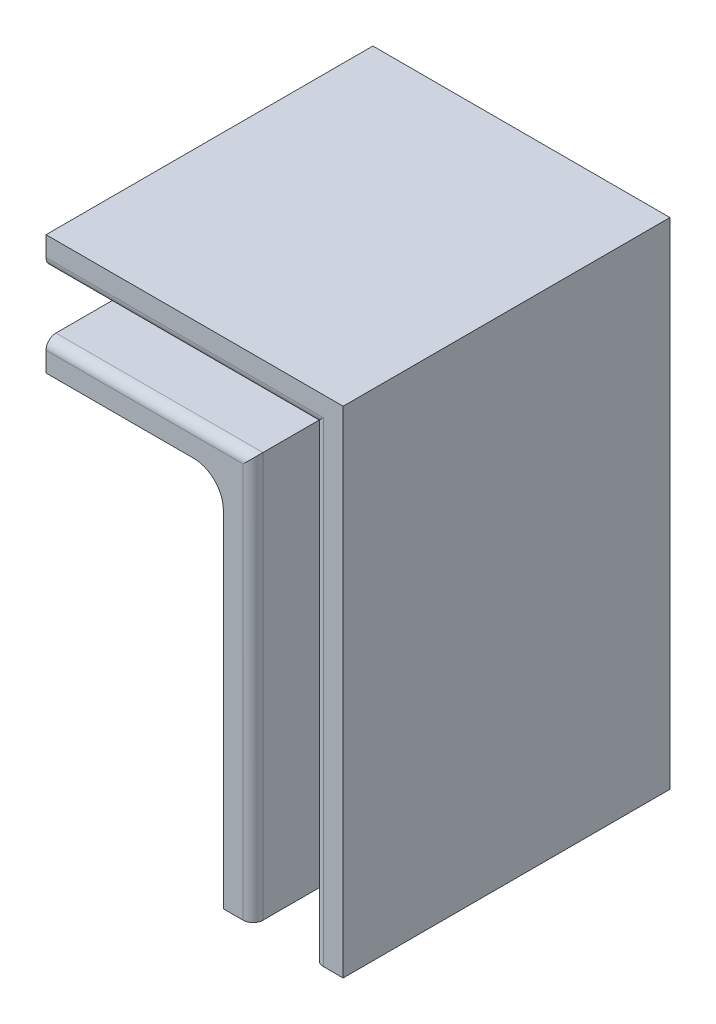
ISO-10303-21;
HEADER;
FILE_DESCRIPTION(('STEP AP214'),'2;1');
FILE_NAME('part.step','',(''),(''),'','','');
FILE_SCHEMA(('AUTOMOTIVE_DESIGN { 1 0 10303 214 1 1 1 1 }'));
ENDSEC;
DATA;
#1=APPLICATION_CONTEXT('core data for automotive mechanical design processes');
#2=APPLICATION_PROTOCOL_DEFINITION('international standard','automotive_design',2000,#1);
#3=PRODUCT_CONTEXT('',#1,'mechanical');
#4=PRODUCT('Part','Part','',(#3));
#5=PRODUCT_RELATED_PRODUCT_CATEGORY('part','',(#4));
#6=PRODUCT_DEFINITION_FORMATION('','',#4);
#7=PRODUCT_DEFINITION_CONTEXT('part definition',#1,'design');
#8=PRODUCT_DEFINITION('design','',#6,#7);
#9=PRODUCT_DEFINITION_SHAPE('','',#8);
#10=(LENGTH_UNIT() NAMED_UNIT(*) SI_UNIT(.MILLI.,.METRE.));
#11=(NAMED_UNIT(*) PLANE_ANGLE_UNIT() SI_UNIT($,.RADIAN.));
#12=(NAMED_UNIT(*) SI_UNIT($,.STERADIAN.) SOLID_ANGLE_UNIT());
#13=UNCERTAINTY_MEASURE_WITH_UNIT(LENGTH_MEASURE(1.E-05),#10,'distance_accuracy_value','');
#14=(GEOMETRIC_REPRESENTATION_CONTEXT(3) GLOBAL_UNCERTAINTY_ASSIGNED_CONTEXT((#13)) GLOBAL_UNIT_ASSIGNED_CONTEXT((#10,
#11,#12)) REPRESENTATION_CONTEXT('',''));
#15=CARTESIAN_POINT('',(0.,0.,0.));
#16=DIRECTION('',(0.,0.,1.));
#17=DIRECTION('',(1.,0.,0.));
#18=AXIS2_PLACEMENT_3D('',#15,#16,#17);
#19=CARTESIAN_POINT('',(0.,0.,3.));
#20=DIRECTION('',(0.,0.,-1.));
#21=DIRECTION('',(-1.,0.,0.));
#22=AXIS2_PLACEMENT_3D('',#19,#20,#21);
#23=PLANE('',#22);
#24=DIRECTION('',(0.,-1.,0.));
#25=VECTOR('',#24,1.);
#26=CARTESIAN_POINT('',(14.9,37.9,3.));
#27=LINE('',#26,#25);
#28=CARTESIAN_POINT('',(14.9,0.,3.));
#29=VERTEX_POINT('',#28);
#30=CARTESIAN_POINT('',(14.9,34.9,3.));
#31=VERTEX_POINT('',#30);
#32=EDGE_CURVE('E280',#29,#31,#27,.F.);
#33=ORIENTED_EDGE('',*,*,#32,.T.);
#34=DIRECTION('',(1.,0.,0.));
#35=VECTOR('',#34,1.);
#36=CARTESIAN_POINT('',(0.,34.9,3.));
#37=LINE('',#36,#35);
#38=CARTESIAN_POINT('',(0.,34.9,3.));
#39=VERTEX_POINT('',#38);
#40=EDGE_CURVE('E282',#31,#39,#37,.F.);
#41=ORIENTED_EDGE('',*,*,#40,.T.);
#42=DIRECTION('',(0.,-1.,0.));
#43=VECTOR('',#42,1.);
#44=CARTESIAN_POINT('',(0.,0.,3.));
#45=LINE('',#44,#43);
#46=CARTESIAN_POINT('',(0.,0.,3.));
#47=VERTEX_POINT('',#46);
#48=EDGE_CURVE('E231',#39,#47,#45,.T.);
#49=ORIENTED_EDGE('',*,*,#48,.T.);
#50=DIRECTION('',(1.,0.,0.));
#51=VECTOR('',#50,1.);
#52=CARTESIAN_POINT('',(0.,0.,3.));
#53=LINE('',#52,#51);
#54=EDGE_CURVE('E235',#47,#29,#53,.T.);
#55=ORIENTED_EDGE('',*,*,#54,.T.);
#56=EDGE_LOOP('',(#33,#41,#49,#55));
#57=FACE_BOUND('',#56,.T.);
#58=ADVANCED_FACE('F33',(#57),#23,.F.);
#59=DIRECTION('',(0.,-1.,0.));
#60=VECTOR('',#59,1.);
#61=CARTESIAN_POINT('',(24.,47.,3.));
#62=LINE('',#61,#60);
#63=CARTESIAN_POINT('',(24.,0.,3.));
#64=VERTEX_POINT('',#63);
#65=CARTESIAN_POINT('',(24.,44.,3.));
#66=VERTEX_POINT('',#65);
#67=EDGE_CURVE('E265',#64,#66,#62,.F.);
#68=ORIENTED_EDGE('',*,*,#67,.T.);
#69=DIRECTION('',(1.,0.,0.));
#70=VECTOR('',#69,1.);
#71=CARTESIAN_POINT('',(0.,44.,3.));
#72=LINE('',#71,#70);
#73=CARTESIAN_POINT('',(0.,44.,3.));
#74=VERTEX_POINT('',#73);
#75=EDGE_CURVE('E267',#66,#74,#72,.F.);
#76=ORIENTED_EDGE('',*,*,#75,.T.);
#77=CARTESIAN_POINT('',(0.,43.9,3.));
#78=VERTEX_POINT('',#77);
#79=EDGE_CURVE('E233',#74,#78,#45,.T.);
#80=ORIENTED_EDGE('',*,*,#79,.T.);
#81=DIRECTION('',(-1.,0.,0.));
#82=VECTOR('',#81,1.);
#83=CARTESIAN_POINT('',(20.9,43.9,3.));
#84=LINE('',#83,#82);
#85=CARTESIAN_POINT('',(23.9,43.9,3.));
#86=VERTEX_POINT('',#85);
#87=EDGE_CURVE('E263',#78,#86,#84,.F.);
#88=ORIENTED_EDGE('',*,*,#87,.T.);
#89=DIRECTION('',(0.,1.,0.));
#90=VECTOR('',#89,1.);
#91=CARTESIAN_POINT('',(23.9,0.,3.));
#92=LINE('',#91,#90);
#93=CARTESIAN_POINT('',(23.9,0.,3.));
#94=VERTEX_POINT('',#93);
#95=EDGE_CURVE('E261',#86,#94,#92,.F.);
#96=ORIENTED_EDGE('',*,*,#95,.T.);
#97=EDGE_CURVE('E239',#94,#64,#53,.T.);
#98=ORIENTED_EDGE('',*,*,#97,.T.);
#99=EDGE_LOOP('',(#68,#76,#80,#88,#96,#98));
#100=FACE_BOUND('',#99,.T.);
#101=ADVANCED_FACE('F379',(#100),#23,.F.);
#102=CARTESIAN_POINT('',(0.,0.,3.));
#103=DIRECTION('',(1.,0.,0.));
#104=DIRECTION('',(0.,0.,-1.));
#105=AXIS2_PLACEMENT_3D('',#102,#103,#104);
#106=PLANE('',#105);
#107=DIRECTION('',(0.,-1.,0.));
#108=VECTOR('',#107,1.);
#109=CARTESIAN_POINT('',(0.,37.9,33.));
#110=LINE('',#109,#108);
#111=CARTESIAN_POINT('',(0.,39.9,33.));
#112=VERTEX_POINT('',#111);
#113=CARTESIAN_POINT('',(0.,37.9,33.));
#114=VERTEX_POINT('',#113);
#115=EDGE_CURVE('E182',#112,#114,#110,.T.);
#116=ORIENTED_EDGE('',*,*,#115,.F.);
#117=CARTESIAN_POINT('',(0.,39.9,32.));
#118=DIRECTION('',(1.,0.,0.));
#119=DIRECTION('',(0.,0.,-1.));
#120=AXIS2_PLACEMENT_3D('',#117,#118,#119);
#121=CIRCLE('',#120,1.);
#122=CARTESIAN_POINT('',(0.,40.9,32.));
#123=VERTEX_POINT('',#122);
#124=EDGE_CURVE('E324',#112,#123,#121,.F.);
#125=ORIENTED_EDGE('',*,*,#124,.T.);
#126=DIRECTION('',(0.,0.,-1.));
#127=VECTOR('',#126,1.);
#128=CARTESIAN_POINT('',(0.,40.9,33.));
#129=LINE('',#128,#127);
#130=CARTESIAN_POINT('',(0.,40.9,6.));
#131=VERTEX_POINT('',#130);
#132=EDGE_CURVE('E401',#123,#131,#129,.T.);
#133=ORIENTED_EDGE('',*,*,#132,.T.);
#134=CARTESIAN_POINT('',(0.,43.9,6.));
#135=DIRECTION('',(1.,0.,0.));
#136=DIRECTION('',(0.,0.,-1.));
#137=AXIS2_PLACEMENT_3D('',#134,#135,#136);
#138=CIRCLE('',#137,3.);
#139=EDGE_CURVE('E290',#131,#78,#138,.T.);
#140=ORIENTED_EDGE('',*,*,#139,.T.);
#141=ORIENTED_EDGE('',*,*,#79,.F.);
#142=CARTESIAN_POINT('',(0.,44.,6.));
#143=DIRECTION('',(1.,0.,0.));
#144=DIRECTION('',(0.,0.,-1.));
#145=AXIS2_PLACEMENT_3D('',#142,#143,#144);
#146=CIRCLE('',#145,3.);
#147=CARTESIAN_POINT('',(0.,47.,6.));
#148=VERTEX_POINT('',#147);
#149=EDGE_CURVE('E292',#74,#148,#146,.T.);
#150=ORIENTED_EDGE('',*,*,#149,.T.);
#151=DIRECTION('',(0.,0.,-1.));
#152=VECTOR('',#151,1.);
#153=CARTESIAN_POINT('',(0.,47.,33.));
#154=LINE('',#153,#152);
#155=CARTESIAN_POINT('',(0.,47.,32.));
#156=VERTEX_POINT('',#155);
#157=EDGE_CURVE('E228',#156,#148,#154,.T.);
#158=ORIENTED_EDGE('',*,*,#157,.F.);
#159=CARTESIAN_POINT('',(0.,48.,32.));
#160=DIRECTION('',(1.,0.,0.));
#161=DIRECTION('',(0.,0.,-1.));
#162=AXIS2_PLACEMENT_3D('',#159,#160,#161);
#163=CIRCLE('',#162,1.);
#164=CARTESIAN_POINT('',(0.,48.,33.));
#165=VERTEX_POINT('',#164);
#166=EDGE_CURVE('E322',#156,#165,#163,.F.);
#167=ORIENTED_EDGE('',*,*,#166,.T.);
#168=DIRECTION('',(0.,-1.,0.));
#169=VECTOR('',#168,1.);
#170=CARTESIAN_POINT('',(0.,47.,33.));
#171=LINE('',#170,#169);
#172=CARTESIAN_POINT('',(0.,50.,33.));
#173=VERTEX_POINT('',#172);
#174=EDGE_CURVE('E206',#173,#165,#171,.T.);
#175=ORIENTED_EDGE('',*,*,#174,.F.);
#176=DIRECTION('',(0.,0.,-1.));
#177=VECTOR('',#176,1.);
#178=CARTESIAN_POINT('',(0.,50.,3.));
#179=LINE('',#178,#177);
#180=CARTESIAN_POINT('',(0.,50.,0.));
#181=VERTEX_POINT('',#180);
#182=EDGE_CURVE('E238',#173,#181,#179,.T.);
#183=ORIENTED_EDGE('',*,*,#182,.T.);
#184=DIRECTION('',(0.,-1.,0.));
#185=VECTOR('',#184,1.);
#186=CARTESIAN_POINT('',(0.,0.,0.));
#187=LINE('',#186,#185);
#188=CARTESIAN_POINT('',(0.,0.,0.));
#189=VERTEX_POINT('',#188);
#190=EDGE_CURVE('E230',#181,#189,#187,.T.);
#191=ORIENTED_EDGE('',*,*,#190,.T.);
#192=DIRECTION('',(0.,0.,-1.));
#193=VECTOR('',#192,1.);
#194=CARTESIAN_POINT('',(0.,0.,3.));
#195=LINE('',#194,#193);
#196=EDGE_CURVE('E255',#47,#189,#195,.T.);
#197=ORIENTED_EDGE('',*,*,#196,.F.);
#198=ORIENTED_EDGE('',*,*,#48,.F.);
#199=CARTESIAN_POINT('',(0.,34.9,6.));
#200=DIRECTION('',(1.,0.,0.));
#201=DIRECTION('',(0.,0.,-1.));
#202=AXIS2_PLACEMENT_3D('',#199,#200,#201);
#203=CIRCLE('',#202,3.);
#204=CARTESIAN_POINT('',(0.,37.9,6.));
#205=VERTEX_POINT('',#204);
#206=EDGE_CURVE('E205',#39,#205,#203,.T.);
#207=ORIENTED_EDGE('',*,*,#206,.T.);
#208=DIRECTION('',(0.,0.,-1.));
#209=VECTOR('',#208,1.);
#210=CARTESIAN_POINT('',(0.,37.9,33.));
#211=LINE('',#210,#209);
#212=EDGE_CURVE('E196',#114,#205,#211,.T.);
#213=ORIENTED_EDGE('',*,*,#212,.F.);
#214=EDGE_LOOP('',(#116,#125,#133,#140,#141,#150,#158,#167,#175,#183,#191,#197,#198,#207,#213));
#215=FACE_BOUND('',#214,.T.);
#216=ADVANCED_FACE('F202',(#215),#106,.F.);
#217=CARTESIAN_POINT('',(0.,0.,3.));
#218=DIRECTION('',(0.,1.,0.));
#219=DIRECTION('',(0.,0.,1.));
#220=AXIS2_PLACEMENT_3D('',#217,#218,#219);
#221=PLANE('',#220);
#222=DIRECTION('',(1.,0.,0.));
#223=VECTOR('',#222,1.);
#224=CARTESIAN_POINT('',(30.,0.,33.));
#225=LINE('',#224,#223);
#226=CARTESIAN_POINT('',(28.,0.,33.));
#227=VERTEX_POINT('',#226);
#228=CARTESIAN_POINT('',(30.,0.,33.));
#229=VERTEX_POINT('',#228);
#230=EDGE_CURVE('E210',#227,#229,#225,.T.);
#231=ORIENTED_EDGE('',*,*,#230,.F.);
#232=CARTESIAN_POINT('',(28.,0.,32.));
#233=DIRECTION('',(0.,1.,0.));
#234=DIRECTION('',(0.,0.,1.));
#235=AXIS2_PLACEMENT_3D('',#232,#233,#234);
#236=CIRCLE('',#235,1.);
#237=CARTESIAN_POINT('',(27.,0.,32.));
#238=VERTEX_POINT('',#237);
#239=EDGE_CURVE('E56',#227,#238,#236,.F.);
#240=ORIENTED_EDGE('',*,*,#239,.T.);
#241=DIRECTION('',(0.,0.,-1.));
#242=VECTOR('',#241,1.);
#243=CARTESIAN_POINT('',(27.,0.,33.));
#244=LINE('',#243,#242);
#245=CARTESIAN_POINT('',(27.,0.,6.));
#246=VERTEX_POINT('',#245);
#247=EDGE_CURVE('E224',#238,#246,#244,.T.);
#248=ORIENTED_EDGE('',*,*,#247,.T.);
#249=CARTESIAN_POINT('',(24.,0.,6.));
#250=DIRECTION('',(0.,1.,0.));
#251=DIRECTION('',(0.,0.,1.));
#252=AXIS2_PLACEMENT_3D('',#249,#250,#251);
#253=CIRCLE('',#252,3.);
#254=EDGE_CURVE('E300',#246,#64,#253,.T.);
#255=ORIENTED_EDGE('',*,*,#254,.T.);
#256=ORIENTED_EDGE('',*,*,#97,.F.);
#257=CARTESIAN_POINT('',(23.9,0.,6.));
#258=DIRECTION('',(0.,1.,0.));
#259=DIRECTION('',(0.,0.,1.));
#260=AXIS2_PLACEMENT_3D('',#257,#258,#259);
#261=CIRCLE('',#260,3.);
#262=CARTESIAN_POINT('',(20.9,0.,6.));
#263=VERTEX_POINT('',#262);
#264=EDGE_CURVE('E302',#94,#263,#261,.T.);
#265=ORIENTED_EDGE('',*,*,#264,.T.);
#266=DIRECTION('',(0.,0.,-1.));
#267=VECTOR('',#266,1.);
#268=CARTESIAN_POINT('',(20.9,0.,33.));
#269=LINE('',#268,#267);
#270=CARTESIAN_POINT('',(20.9,0.,32.));
#271=VERTEX_POINT('',#270);
#272=EDGE_CURVE('E213',#271,#263,#269,.T.);
#273=ORIENTED_EDGE('',*,*,#272,.F.);
#274=CARTESIAN_POINT('',(19.9,0.,32.));
#275=DIRECTION('',(0.,1.,0.));
#276=DIRECTION('',(0.,0.,1.));
#277=AXIS2_PLACEMENT_3D('',#274,#275,#276);
#278=CIRCLE('',#277,1.);
#279=CARTESIAN_POINT('',(19.9,0.,33.));
#280=VERTEX_POINT('',#279);
#281=EDGE_CURVE('E335',#271,#280,#278,.F.);
#282=ORIENTED_EDGE('',*,*,#281,.T.);
#283=DIRECTION('',(1.,0.,0.));
#284=VECTOR('',#283,1.);
#285=CARTESIAN_POINT('',(20.9,0.,33.));
#286=LINE('',#285,#284);
#287=CARTESIAN_POINT('',(17.9,0.,33.));
#288=VERTEX_POINT('',#287);
#289=EDGE_CURVE('E398',#288,#280,#286,.T.);
#290=ORIENTED_EDGE('',*,*,#289,.F.);
#291=DIRECTION('',(0.,0.,-1.));
#292=VECTOR('',#291,1.);
#293=CARTESIAN_POINT('',(17.9,0.,33.));
#294=LINE('',#293,#292);
#295=CARTESIAN_POINT('',(17.9,0.,6.));
#296=VERTEX_POINT('',#295);
#297=EDGE_CURVE('E207',#288,#296,#294,.T.);
#298=ORIENTED_EDGE('',*,*,#297,.T.);
#299=CARTESIAN_POINT('',(14.9,0.,6.));
#300=DIRECTION('',(0.,1.,0.));
#301=DIRECTION('',(0.,0.,1.));
#302=AXIS2_PLACEMENT_3D('',#299,#300,#301);
#303=CIRCLE('',#302,3.);
#304=EDGE_CURVE('E298',#296,#29,#303,.T.);
#305=ORIENTED_EDGE('',*,*,#304,.T.);
#306=ORIENTED_EDGE('',*,*,#54,.F.);
#307=ORIENTED_EDGE('',*,*,#196,.T.);
#308=DIRECTION('',(1.,0.,0.));
#309=VECTOR('',#308,1.);
#310=CARTESIAN_POINT('',(0.,0.,0.));
#311=LINE('',#310,#309);
#312=CARTESIAN_POINT('',(30.,0.,0.));
#313=VERTEX_POINT('',#312);
#314=EDGE_CURVE('E242',#189,#313,#311,.T.);
#315=ORIENTED_EDGE('',*,*,#314,.T.);
#316=DIRECTION('',(0.,0.,-1.));
#317=VECTOR('',#316,1.);
#318=CARTESIAN_POINT('',(30.,0.,3.));
#319=LINE('',#318,#317);
#320=EDGE_CURVE('E252',#229,#313,#319,.T.);
#321=ORIENTED_EDGE('',*,*,#320,.F.);
#322=EDGE_LOOP('',(#231,#240,#248,#255,#256,#265,#273,#282,#290,#298,#305,#306,#307,#315,#321));
#323=FACE_BOUND('',#322,.T.);
#324=ADVANCED_FACE('F376',(#323),#221,.F.);
#325=CARTESIAN_POINT('',(30.,0.,3.));
#326=DIRECTION('',(-1.,0.,0.));
#327=DIRECTION('',(0.,0.,1.));
#328=AXIS2_PLACEMENT_3D('',#325,#326,#327);
#329=PLANE('',#328);
#330=DIRECTION('',(0.,1.,0.));
#331=VECTOR('',#330,1.);
#332=CARTESIAN_POINT('',(30.,0.,0.));
#333=LINE('',#332,#331);
#334=CARTESIAN_POINT('',(30.,50.,0.));
#335=VERTEX_POINT('',#334);
#336=EDGE_CURVE('E244',#313,#335,#333,.T.);
#337=ORIENTED_EDGE('',*,*,#336,.T.);
#338=DIRECTION('',(0.,0.,-1.));
#339=VECTOR('',#338,1.);
#340=CARTESIAN_POINT('',(30.,50.,3.));
#341=LINE('',#340,#339);
#342=CARTESIAN_POINT('',(30.,50.,33.));
#343=VERTEX_POINT('',#342);
#344=EDGE_CURVE('E249',#343,#335,#341,.T.);
#345=ORIENTED_EDGE('',*,*,#344,.F.);
#346=DIRECTION('',(0.,1.,0.));
#347=VECTOR('',#346,1.);
#348=CARTESIAN_POINT('',(30.,50.,33.));
#349=LINE('',#348,#347);
#350=EDGE_CURVE('E218',#229,#343,#349,.T.);
#351=ORIENTED_EDGE('',*,*,#350,.F.);
#352=ORIENTED_EDGE('',*,*,#320,.T.);
#353=EDGE_LOOP('',(#337,#345,#351,#352));
#354=FACE_BOUND('',#353,.T.);
#355=ADVANCED_FACE('F436',(#354),#329,.F.);
#356=CARTESIAN_POINT('',(0.,50.,3.));
#357=DIRECTION('',(0.,-1.,0.));
#358=DIRECTION('',(0.,0.,-1.));
#359=AXIS2_PLACEMENT_3D('',#356,#357,#358);
#360=PLANE('',#359);
#361=DIRECTION('',(-1.,0.,0.));
#362=VECTOR('',#361,1.);
#363=CARTESIAN_POINT('',(0.,50.,0.));
#364=LINE('',#363,#362);
#365=EDGE_CURVE('E234',#335,#181,#364,.T.);
#366=ORIENTED_EDGE('',*,*,#365,.T.);
#367=ORIENTED_EDGE('',*,*,#182,.F.);
#368=DIRECTION('',(-1.,0.,0.));
#369=VECTOR('',#368,1.);
#370=CARTESIAN_POINT('',(0.,50.,33.));
#371=LINE('',#370,#369);
#372=EDGE_CURVE('E221',#343,#173,#371,.T.);
#373=ORIENTED_EDGE('',*,*,#372,.F.);
#374=ORIENTED_EDGE('',*,*,#344,.T.);
#375=EDGE_LOOP('',(#366,#367,#373,#374));
#376=FACE_BOUND('',#375,.T.);
#377=ADVANCED_FACE('F432',(#376),#360,.F.);
#378=CARTESIAN_POINT('',(0.,0.,0.));
#379=DIRECTION('',(0.,0.,-1.));
#380=DIRECTION('',(-1.,0.,0.));
#381=AXIS2_PLACEMENT_3D('',#378,#379,#380);
#382=PLANE('',#381);
#383=ORIENTED_EDGE('',*,*,#190,.F.);
#384=ORIENTED_EDGE('',*,*,#365,.F.);
#385=ORIENTED_EDGE('',*,*,#336,.F.);
#386=ORIENTED_EDGE('',*,*,#314,.F.);
#387=EDGE_LOOP('',(#383,#384,#385,#386));
#388=FACE_BOUND('',#387,.T.);
#389=ADVANCED_FACE('F429',(#388),#382,.T.);
#390=CARTESIAN_POINT('',(27.,47.,33.));
#391=DIRECTION('',(0.,1.,0.));
#392=DIRECTION('',(0.,0.,1.));
#393=AXIS2_PLACEMENT_3D('',#390,#391,#392);
#394=PLANE('',#393);
#395=DIRECTION('',(0.,0.,-1.));
#396=VECTOR('',#395,1.);
#397=CARTESIAN_POINT('',(27.,47.,33.));
#398=LINE('',#397,#396);
#399=CARTESIAN_POINT('',(27.,47.,32.));
#400=VERTEX_POINT('',#399);
#401=CARTESIAN_POINT('',(27.,47.,6.));
#402=VERTEX_POINT('',#401);
#403=EDGE_CURVE('E226',#400,#402,#398,.T.);
#404=ORIENTED_EDGE('',*,*,#403,.F.);
#405=DIRECTION('',(1.,0.,0.));
#406=VECTOR('',#405,1.);
#407=CARTESIAN_POINT('',(27.,47.,32.));
#408=LINE('',#407,#406);
#409=EDGE_CURVE('E333',#400,#156,#408,.F.);
#410=ORIENTED_EDGE('',*,*,#409,.T.);
#411=ORIENTED_EDGE('',*,*,#157,.T.);
#412=DIRECTION('',(1.,0.,0.));
#413=VECTOR('',#412,1.);
#414=CARTESIAN_POINT('',(27.,47.,6.));
#415=LINE('',#414,#413);
#416=EDGE_CURVE('E269',#148,#402,#415,.T.);
#417=ORIENTED_EDGE('',*,*,#416,.T.);
#418=EDGE_LOOP('',(#404,#410,#411,#417));
#419=FACE_BOUND('',#418,.T.);
#420=ADVANCED_FACE('F362',(#419),#394,.F.);
#421=CARTESIAN_POINT('',(27.,0.,33.));
#422=DIRECTION('',(1.,0.,0.));
#423=DIRECTION('',(0.,0.,-1.));
#424=AXIS2_PLACEMENT_3D('',#421,#422,#423);
#425=PLANE('',#424);
#426=ORIENTED_EDGE('',*,*,#247,.F.);
#427=DIRECTION('',(0.,-1.,0.));
#428=VECTOR('',#427,1.);
#429=CARTESIAN_POINT('',(27.,0.,32.));
#430=LINE('',#429,#428);
#431=EDGE_CURVE('E42',#238,#400,#430,.F.);
#432=ORIENTED_EDGE('',*,*,#431,.T.);
#433=ORIENTED_EDGE('',*,*,#403,.T.);
#434=DIRECTION('',(0.,-1.,0.));
#435=VECTOR('',#434,1.);
#436=CARTESIAN_POINT('',(27.,0.,6.));
#437=LINE('',#436,#435);
#438=EDGE_CURVE('E284',#402,#246,#437,.T.);
#439=ORIENTED_EDGE('',*,*,#438,.T.);
#440=EDGE_LOOP('',(#426,#432,#433,#439));
#441=FACE_BOUND('',#440,.T.);
#442=ADVANCED_FACE('F364',(#441),#425,.F.);
#443=CARTESIAN_POINT('',(0.,0.,33.));
#444=DIRECTION('',(0.,0.,-1.));
#445=DIRECTION('',(-1.,0.,0.));
#446=AXIS2_PLACEMENT_3D('',#443,#444,#445);
#447=PLANE('',#446);
#448=ORIENTED_EDGE('',*,*,#174,.T.);
#449=DIRECTION('',(1.,0.,0.));
#450=VECTOR('',#449,1.);
#451=CARTESIAN_POINT('',(0.,48.,33.));
#452=LINE('',#451,#450);
#453=CARTESIAN_POINT('',(28.,48.,33.));
#454=VERTEX_POINT('',#453);
#455=EDGE_CURVE('E330',#165,#454,#452,.T.);
#456=ORIENTED_EDGE('',*,*,#455,.T.);
#457=DIRECTION('',(0.,-1.,0.));
#458=VECTOR('',#457,1.);
#459=CARTESIAN_POINT('',(28.,0.,33.));
#460=LINE('',#459,#458);
#461=EDGE_CURVE('E328',#454,#227,#460,.T.);
#462=ORIENTED_EDGE('',*,*,#461,.T.);
#463=ORIENTED_EDGE('',*,*,#230,.T.);
#464=ORIENTED_EDGE('',*,*,#350,.T.);
#465=ORIENTED_EDGE('',*,*,#372,.T.);
#466=EDGE_LOOP('',(#448,#456,#462,#463,#464,#465));
#467=FACE_BOUND('',#466,.T.);
#468=ADVANCED_FACE('F352',(#467),#447,.F.);
#469=CARTESIAN_POINT('',(17.9,37.9,33.));
#470=DIRECTION('',(0.,1.,0.));
#471=DIRECTION('',(0.,0.,1.));
#472=AXIS2_PLACEMENT_3D('',#469,#470,#471);
#473=PLANE('',#472);
#474=DIRECTION('',(1.,0.,0.));
#475=VECTOR('',#474,1.);
#476=CARTESIAN_POINT('',(17.9,37.9,6.));
#477=LINE('',#476,#475);
#478=CARTESIAN_POINT('',(14.9,37.9,6.));
#479=VERTEX_POINT('',#478);
#480=EDGE_CURVE('E277',#205,#479,#477,.T.);
#481=ORIENTED_EDGE('',*,*,#480,.T.);
#482=DIRECTION('',(0.,0.,-1.));
#483=VECTOR('',#482,1.);
#484=CARTESIAN_POINT('',(14.9,37.9,33.));
#485=LINE('',#484,#483);
#486=CARTESIAN_POINT('',(14.9,37.9,33.));
#487=VERTEX_POINT('',#486);
#488=EDGE_CURVE('E199',#479,#487,#485,.F.);
#489=ORIENTED_EDGE('',*,*,#488,.T.);
#490=DIRECTION('',(1.,0.,0.));
#491=VECTOR('',#490,1.);
#492=CARTESIAN_POINT('',(17.9,37.9,33.));
#493=LINE('',#492,#491);
#494=EDGE_CURVE('E185',#114,#487,#493,.T.);
#495=ORIENTED_EDGE('',*,*,#494,.F.);
#496=ORIENTED_EDGE('',*,*,#212,.T.);
#497=EDGE_LOOP('',(#481,#489,#495,#496));
#498=FACE_BOUND('',#497,.T.);
#499=ADVANCED_FACE('F195',(#498),#473,.F.);
#500=CARTESIAN_POINT('',(17.9,0.,33.));
#501=DIRECTION('',(1.,0.,0.));
#502=DIRECTION('',(0.,0.,-1.));
#503=AXIS2_PLACEMENT_3D('',#500,#501,#502);
#504=PLANE('',#503);
#505=DIRECTION('',(0.,-1.,0.));
#506=VECTOR('',#505,1.);
#507=CARTESIAN_POINT('',(17.9,0.,33.));
#508=LINE('',#507,#506);
#509=CARTESIAN_POINT('',(17.9,34.9,33.));
#510=VERTEX_POINT('',#509);
#511=EDGE_CURVE('E200',#510,#288,#508,.T.);
#512=ORIENTED_EDGE('',*,*,#511,.F.);
#513=DIRECTION('',(0.,0.,-1.));
#514=VECTOR('',#513,1.);
#515=CARTESIAN_POINT('',(17.9,34.9,3.));
#516=LINE('',#515,#514);
#517=CARTESIAN_POINT('',(17.9,34.9,6.));
#518=VERTEX_POINT('',#517);
#519=EDGE_CURVE('E274',#510,#518,#516,.T.);
#520=ORIENTED_EDGE('',*,*,#519,.T.);
#521=DIRECTION('',(0.,-1.,0.));
#522=VECTOR('',#521,1.);
#523=CARTESIAN_POINT('',(17.9,0.,6.));
#524=LINE('',#523,#522);
#525=EDGE_CURVE('E272',#518,#296,#524,.T.);
#526=ORIENTED_EDGE('',*,*,#525,.T.);
#527=ORIENTED_EDGE('',*,*,#297,.F.);
#528=EDGE_LOOP('',(#512,#520,#526,#527));
#529=FACE_BOUND('',#528,.T.);
#530=ADVANCED_FACE('F411',(#529),#504,.F.);
#531=CARTESIAN_POINT('',(20.9,40.9,33.));
#532=DIRECTION('',(-1.,0.,0.));
#533=DIRECTION('',(0.,-1.,0.));
#534=AXIS2_PLACEMENT_3D('',#531,#532,#533);
#535=PLANE('',#534);
#536=DIRECTION('',(0.,0.,-1.));
#537=VECTOR('',#536,1.);
#538=CARTESIAN_POINT('',(20.9,40.9,33.));
#539=LINE('',#538,#537);
#540=CARTESIAN_POINT('',(20.9,40.9,32.));
#541=VERTEX_POINT('',#540);
#542=CARTESIAN_POINT('',(20.9,40.9,6.));
#543=VERTEX_POINT('',#542);
#544=EDGE_CURVE('E394',#541,#543,#539,.T.);
#545=ORIENTED_EDGE('',*,*,#544,.F.);
#546=DIRECTION('',(0.,1.,0.));
#547=VECTOR('',#546,1.);
#548=CARTESIAN_POINT('',(20.9,40.9,32.));
#549=LINE('',#548,#547);
#550=EDGE_CURVE('E11',#541,#271,#549,.F.);
#551=ORIENTED_EDGE('',*,*,#550,.T.);
#552=ORIENTED_EDGE('',*,*,#272,.T.);
#553=DIRECTION('',(0.,1.,0.));
#554=VECTOR('',#553,1.);
#555=CARTESIAN_POINT('',(20.9,40.9,6.));
#556=LINE('',#555,#554);
#557=EDGE_CURVE('E287',#263,#543,#556,.T.);
#558=ORIENTED_EDGE('',*,*,#557,.T.);
#559=EDGE_LOOP('',(#545,#551,#552,#558));
#560=FACE_BOUND('',#559,.T.);
#561=ADVANCED_FACE('F409',(#560),#535,.F.);
#562=CARTESIAN_POINT('',(0.,40.9,33.));
#563=DIRECTION('',(0.,-1.,0.));
#564=DIRECTION('',(0.,0.,-1.));
#565=AXIS2_PLACEMENT_3D('',#562,#563,#564);
#566=PLANE('',#565);
#567=ORIENTED_EDGE('',*,*,#132,.F.);
#568=DIRECTION('',(-1.,0.,0.));
#569=VECTOR('',#568,1.);
#570=CARTESIAN_POINT('',(0.,40.9,32.));
#571=LINE('',#570,#569);
#572=EDGE_CURVE('E326',#123,#541,#571,.F.);
#573=ORIENTED_EDGE('',*,*,#572,.T.);
#574=ORIENTED_EDGE('',*,*,#544,.T.);
#575=DIRECTION('',(-1.,0.,0.));
#576=VECTOR('',#575,1.);
#577=CARTESIAN_POINT('',(0.,40.9,6.));
#578=LINE('',#577,#576);
#579=EDGE_CURVE('E258',#543,#131,#578,.T.);
#580=ORIENTED_EDGE('',*,*,#579,.T.);
#581=EDGE_LOOP('',(#567,#573,#574,#580));
#582=FACE_BOUND('',#581,.T.);
#583=ADVANCED_FACE('F408',(#582),#566,.F.);
#584=CARTESIAN_POINT('',(0.,0.,33.));
#585=DIRECTION('',(0.,0.,-1.));
#586=DIRECTION('',(-1.,0.,0.));
#587=AXIS2_PLACEMENT_3D('',#584,#585,#586);
#588=PLANE('',#587);
#589=DIRECTION('',(0.,1.,0.));
#590=VECTOR('',#589,1.);
#591=CARTESIAN_POINT('',(19.9,0.,33.));
#592=LINE('',#591,#590);
#593=CARTESIAN_POINT('',(19.9,39.9,33.));
#594=VERTEX_POINT('',#593);
#595=EDGE_CURVE('E305',#280,#594,#592,.T.);
#596=ORIENTED_EDGE('',*,*,#595,.T.);
#597=DIRECTION('',(-1.,0.,0.));
#598=VECTOR('',#597,1.);
#599=CARTESIAN_POINT('',(0.,39.9,33.));
#600=LINE('',#599,#598);
#601=EDGE_CURVE('E188',#594,#112,#600,.T.);
#602=ORIENTED_EDGE('',*,*,#601,.T.);
#603=ORIENTED_EDGE('',*,*,#115,.T.);
#604=ORIENTED_EDGE('',*,*,#494,.T.);
#605=CARTESIAN_POINT('',(14.9,34.9,33.));
#606=DIRECTION('',(0.,0.,-1.));
#607=DIRECTION('',(-1.,0.,0.));
#608=AXIS2_PLACEMENT_3D('',#605,#606,#607);
#609=CIRCLE('',#608,3.);
#610=EDGE_CURVE('E295',#487,#510,#609,.T.);
#611=ORIENTED_EDGE('',*,*,#610,.T.);
#612=ORIENTED_EDGE('',*,*,#511,.T.);
#613=ORIENTED_EDGE('',*,*,#289,.T.);
#614=EDGE_LOOP('',(#596,#602,#603,#604,#611,#612,#613));
#615=FACE_BOUND('',#614,.T.);
#616=ADVANCED_FACE('F184',(#615),#588,.F.);
#617=CARTESIAN_POINT('',(23.9,40.9,6.));
#618=DIRECTION('',(0.,-1.,0.));
#619=DIRECTION('',(1.,0.,0.));
#620=AXIS2_PLACEMENT_3D('',#617,#618,#619);
#621=CYLINDRICAL_SURFACE('',#620,3.);
#622=ORIENTED_EDGE('',*,*,#264,.F.);
#623=ORIENTED_EDGE('',*,*,#95,.F.);
#624=CARTESIAN_POINT('',(23.9,43.9,6.));
#625=DIRECTION('',(0.707106781186547,-0.707106781186547,0.));
#626=DIRECTION('',(-0.707106781186547,-0.707106781186548,0.));
#627=AXIS2_PLACEMENT_3D('',#624,#625,#626);
#628=ELLIPSE('',#627,4.24264068711928,3.);
#629=EDGE_CURVE('E191',#543,#86,#628,.T.);
#630=ORIENTED_EDGE('',*,*,#629,.F.);
#631=ORIENTED_EDGE('',*,*,#557,.F.);
#632=EDGE_LOOP('',(#622,#623,#630,#631));
#633=FACE_BOUND('',#632,.T.);
#634=ADVANCED_FACE('F390',(#633),#621,.F.);
#635=CARTESIAN_POINT('',(0.,43.9,6.));
#636=DIRECTION('',(1.,0.,0.));
#637=DIRECTION('',(0.,0.,-1.));
#638=AXIS2_PLACEMENT_3D('',#635,#636,#637);
#639=CYLINDRICAL_SURFACE('',#638,3.);
#640=ORIENTED_EDGE('',*,*,#629,.T.);
#641=ORIENTED_EDGE('',*,*,#87,.F.);
#642=ORIENTED_EDGE('',*,*,#139,.F.);
#643=ORIENTED_EDGE('',*,*,#579,.F.);
#644=EDGE_LOOP('',(#640,#641,#642,#643));
#645=FACE_BOUND('',#644,.T.);
#646=ADVANCED_FACE('F385',(#645),#639,.F.);
#647=CARTESIAN_POINT('',(24.,0.,6.));
#648=DIRECTION('',(0.,1.,0.));
#649=DIRECTION('',(0.,0.,1.));
#650=AXIS2_PLACEMENT_3D('',#647,#648,#649);
#651=CYLINDRICAL_SURFACE('',#650,3.);
#652=ORIENTED_EDGE('',*,*,#254,.F.);
#653=ORIENTED_EDGE('',*,*,#438,.F.);
#654=CARTESIAN_POINT('',(24.,44.,6.));
#655=DIRECTION('',(-0.707106781186547,0.707106781186547,0.));
#656=DIRECTION('',(-0.707106781186547,-0.707106781186547,0.));
#657=AXIS2_PLACEMENT_3D('',#654,#655,#656);
#658=ELLIPSE('',#657,4.24264068711928,3.);
#659=EDGE_CURVE('E308',#66,#402,#658,.F.);
#660=ORIENTED_EDGE('',*,*,#659,.F.);
#661=ORIENTED_EDGE('',*,*,#67,.F.);
#662=EDGE_LOOP('',(#652,#653,#660,#661));
#663=FACE_BOUND('',#662,.T.);
#664=ADVANCED_FACE('F373',(#663),#651,.F.);
#665=CARTESIAN_POINT('',(27.,44.,6.));
#666=DIRECTION('',(-1.,0.,0.));
#667=DIRECTION('',(0.,0.,1.));
#668=AXIS2_PLACEMENT_3D('',#665,#666,#667);
#669=CYLINDRICAL_SURFACE('',#668,3.);
#670=ORIENTED_EDGE('',*,*,#149,.F.);
#671=ORIENTED_EDGE('',*,*,#75,.F.);
#672=ORIENTED_EDGE('',*,*,#659,.T.);
#673=ORIENTED_EDGE('',*,*,#416,.F.);
#674=EDGE_LOOP('',(#670,#671,#672,#673));
#675=FACE_BOUND('',#674,.T.);
#676=ADVANCED_FACE('F370',(#675),#669,.F.);
#677=CARTESIAN_POINT('',(14.9,0.,6.));
#678=DIRECTION('',(0.,1.,0.));
#679=DIRECTION('',(0.,0.,1.));
#680=AXIS2_PLACEMENT_3D('',#677,#678,#679);
#681=CYLINDRICAL_SURFACE('',#680,3.);
#682=ORIENTED_EDGE('',*,*,#304,.F.);
#683=ORIENTED_EDGE('',*,*,#525,.F.);
#684=CARTESIAN_POINT('',(14.9,34.9,6.));
#685=DIRECTION('',(0.,-1.,0.));
#686=DIRECTION('',(0.,0.,-1.));
#687=AXIS2_PLACEMENT_3D('',#684,#685,#686);
#688=CIRCLE('',#687,3.);
#689=EDGE_CURVE('E311',#31,#518,#688,.T.);
#690=ORIENTED_EDGE('',*,*,#689,.F.);
#691=ORIENTED_EDGE('',*,*,#32,.F.);
#692=EDGE_LOOP('',(#682,#683,#690,#691));
#693=FACE_BOUND('',#692,.T.);
#694=ADVANCED_FACE('F451',(#693),#681,.F.);
#695=CARTESIAN_POINT('',(17.9,34.9,6.));
#696=DIRECTION('',(-1.,0.,0.));
#697=DIRECTION('',(0.,0.,1.));
#698=AXIS2_PLACEMENT_3D('',#695,#696,#697);
#699=CYLINDRICAL_SURFACE('',#698,3.);
#700=ORIENTED_EDGE('',*,*,#206,.F.);
#701=ORIENTED_EDGE('',*,*,#40,.F.);
#702=CARTESIAN_POINT('',(14.9,34.9,6.));
#703=DIRECTION('',(-1.,0.,0.));
#704=DIRECTION('',(0.,0.,1.));
#705=AXIS2_PLACEMENT_3D('',#702,#703,#704);
#706=CIRCLE('',#705,3.);
#707=EDGE_CURVE('E314',#479,#31,#706,.T.);
#708=ORIENTED_EDGE('',*,*,#707,.F.);
#709=ORIENTED_EDGE('',*,*,#480,.F.);
#710=EDGE_LOOP('',(#700,#701,#708,#709));
#711=FACE_BOUND('',#710,.T.);
#712=ADVANCED_FACE('F461',(#711),#699,.F.);
#713=CARTESIAN_POINT('',(14.9,34.9,6.));
#714=DIRECTION('',(0.,0.,1.));
#715=DIRECTION('',(1.,0.,0.));
#716=AXIS2_PLACEMENT_3D('',#713,#714,#715);
#717=SPHERICAL_SURFACE('',#716,3.);
#718=ORIENTED_EDGE('',*,*,#707,.T.);
#719=ORIENTED_EDGE('',*,*,#689,.T.);
#720=CARTESIAN_POINT('',(14.9,34.9,6.));
#721=DIRECTION('',(0.,0.,1.));
#722=DIRECTION('',(1.,0.,0.));
#723=AXIS2_PLACEMENT_3D('',#720,#721,#722);
#724=CIRCLE('',#723,3.);
#725=EDGE_CURVE('E312',#479,#518,#724,.F.);
#726=ORIENTED_EDGE('',*,*,#725,.F.);
#727=EDGE_LOOP('',(#718,#719,#726));
#728=FACE_BOUND('',#727,.T.);
#729=ADVANCED_FACE('F457',(#728),#717,.F.);
#730=CARTESIAN_POINT('',(14.9,34.9,33.));
#731=DIRECTION('',(0.,0.,1.));
#732=DIRECTION('',(1.,0.,0.));
#733=AXIS2_PLACEMENT_3D('',#730,#731,#732);
#734=CYLINDRICAL_SURFACE('',#733,3.);
#735=ORIENTED_EDGE('',*,*,#610,.F.);
#736=ORIENTED_EDGE('',*,*,#488,.F.);
#737=ORIENTED_EDGE('',*,*,#725,.T.);
#738=ORIENTED_EDGE('',*,*,#519,.F.);
#739=EDGE_LOOP('',(#735,#736,#737,#738));
#740=FACE_BOUND('',#739,.T.);
#741=ADVANCED_FACE('F454',(#740),#734,.F.);
#742=CARTESIAN_POINT('',(19.9,0.,32.));
#743=DIRECTION('',(0.,1.,0.));
#744=DIRECTION('',(-1.,0.,0.));
#745=AXIS2_PLACEMENT_3D('',#742,#743,#744);
#746=CYLINDRICAL_SURFACE('',#745,1.);
#747=ORIENTED_EDGE('',*,*,#281,.F.);
#748=ORIENTED_EDGE('',*,*,#550,.F.);
#749=CARTESIAN_POINT('',(19.9,39.9,32.));
#750=DIRECTION('',(-0.707106781186547,0.707106781186547,0.));
#751=DIRECTION('',(0.707106781186547,0.707106781186548,0.));
#752=AXIS2_PLACEMENT_3D('',#749,#750,#751);
#753=ELLIPSE('',#752,1.41421356237309,1.);
#754=EDGE_CURVE('E315',#594,#541,#753,.T.);
#755=ORIENTED_EDGE('',*,*,#754,.F.);
#756=ORIENTED_EDGE('',*,*,#595,.F.);
#757=EDGE_LOOP('',(#747,#748,#755,#756));
#758=FACE_BOUND('',#757,.T.);
#759=ADVANCED_FACE('F397',(#758),#746,.T.);
#760=CARTESIAN_POINT('',(0.,39.9,32.));
#761=DIRECTION('',(-1.,0.,0.));
#762=DIRECTION('',(0.,0.,1.));
#763=AXIS2_PLACEMENT_3D('',#760,#761,#762);
#764=CYLINDRICAL_SURFACE('',#763,1.);
#765=ORIENTED_EDGE('',*,*,#754,.T.);
#766=ORIENTED_EDGE('',*,*,#572,.F.);
#767=ORIENTED_EDGE('',*,*,#124,.F.);
#768=ORIENTED_EDGE('',*,*,#601,.F.);
#769=EDGE_LOOP('',(#765,#766,#767,#768));
#770=FACE_BOUND('',#769,.T.);
#771=ADVANCED_FACE('F469',(#770),#764,.T.);
#772=CARTESIAN_POINT('',(28.,0.,32.));
#773=DIRECTION('',(0.,-1.,0.));
#774=DIRECTION('',(0.,0.,-1.));
#775=AXIS2_PLACEMENT_3D('',#772,#773,#774);
#776=CYLINDRICAL_SURFACE('',#775,1.);
#777=ORIENTED_EDGE('',*,*,#239,.F.);
#778=ORIENTED_EDGE('',*,*,#461,.F.);
#779=CARTESIAN_POINT('',(28.,48.,32.));
#780=DIRECTION('',(0.707106781186547,-0.707106781186547,0.));
#781=DIRECTION('',(0.707106781186547,0.707106781186547,0.));
#782=AXIS2_PLACEMENT_3D('',#779,#780,#781);
#783=ELLIPSE('',#782,1.41421356237309,1.);
#784=EDGE_CURVE('E37',#400,#454,#783,.F.);
#785=ORIENTED_EDGE('',*,*,#784,.F.);
#786=ORIENTED_EDGE('',*,*,#431,.F.);
#787=EDGE_LOOP('',(#777,#778,#785,#786));
#788=FACE_BOUND('',#787,.T.);
#789=ADVANCED_FACE('F35',(#788),#776,.T.);
#790=CARTESIAN_POINT('',(0.,48.,32.));
#791=DIRECTION('',(1.,0.,0.));
#792=DIRECTION('',(0.,0.,-1.));
#793=AXIS2_PLACEMENT_3D('',#790,#791,#792);
#794=CYLINDRICAL_SURFACE('',#793,1.);
#795=ORIENTED_EDGE('',*,*,#166,.F.);
#796=ORIENTED_EDGE('',*,*,#409,.F.);
#797=ORIENTED_EDGE('',*,*,#784,.T.);
#798=ORIENTED_EDGE('',*,*,#455,.F.);
#799=EDGE_LOOP('',(#795,#796,#797,#798));
#800=FACE_BOUND('',#799,.T.);
#801=ADVANCED_FACE('F348',(#800),#794,.T.);
#802=CLOSED_SHELL('',(#58,#101,#216,#324,#355,#377,#389,#420,#442,#468,#499,#530,#561,#583,#616,
#634,#646,#664,#676,#694,#712,#729,#741,#759,#771,#789,#801));
#803=MANIFOLD_SOLID_BREP('B2',#802);
#804=ADVANCED_BREP_SHAPE_REPRESENTATION('',(#18,#803),#14);
#805=SHAPE_DEFINITION_REPRESENTATION(#9,#804);
ENDSEC;
END-ISO-10303-21;
